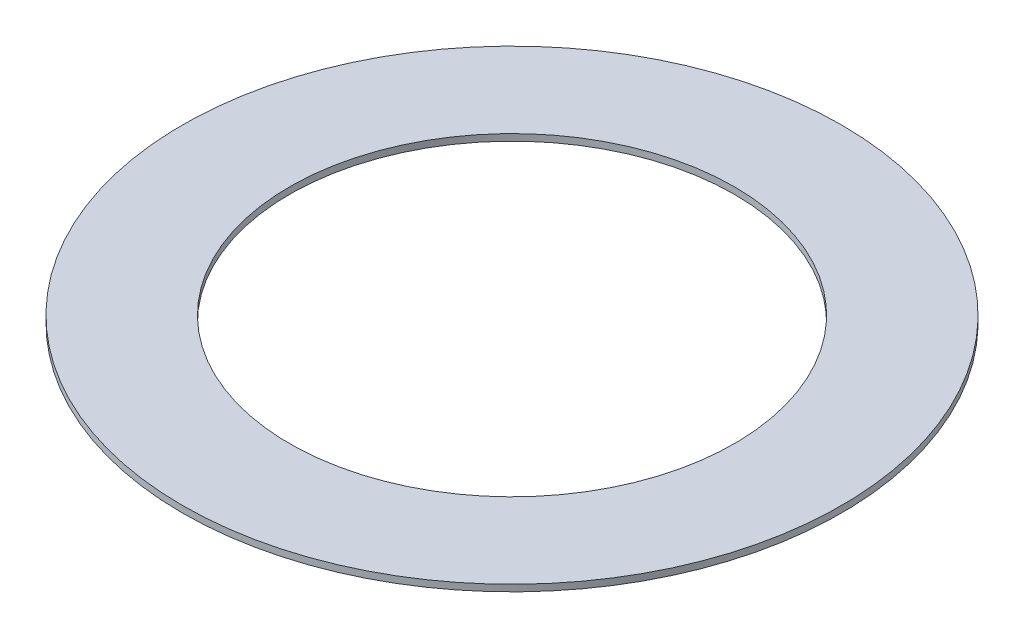
ISO-10303-21;
HEADER;
FILE_DESCRIPTION(('STEP AP214'),'2;1');
FILE_NAME('part.step','',(''),(''),'','','');
FILE_SCHEMA(('AUTOMOTIVE_DESIGN { 1 0 10303 214 1 1 1 1 }'));
ENDSEC;
DATA;
#1=APPLICATION_CONTEXT('core data for automotive mechanical design processes');
#2=APPLICATION_PROTOCOL_DEFINITION('international standard','automotive_design',2000,#1);
#3=PRODUCT_CONTEXT('',#1,'mechanical');
#4=PRODUCT('Part','Part','',(#3));
#5=PRODUCT_RELATED_PRODUCT_CATEGORY('part','',(#4));
#6=PRODUCT_DEFINITION_FORMATION('','',#4);
#7=PRODUCT_DEFINITION_CONTEXT('part definition',#1,'design');
#8=PRODUCT_DEFINITION('design','',#6,#7);
#9=PRODUCT_DEFINITION_SHAPE('','',#8);
#10=(LENGTH_UNIT() NAMED_UNIT(*) SI_UNIT(.MILLI.,.METRE.));
#11=(NAMED_UNIT(*) PLANE_ANGLE_UNIT() SI_UNIT($,.RADIAN.));
#12=(NAMED_UNIT(*) SI_UNIT($,.STERADIAN.) SOLID_ANGLE_UNIT());
#13=UNCERTAINTY_MEASURE_WITH_UNIT(LENGTH_MEASURE(1.E-05),#10,'distance_accuracy_value','');
#14=(GEOMETRIC_REPRESENTATION_CONTEXT(3) GLOBAL_UNCERTAINTY_ASSIGNED_CONTEXT((#13)) GLOBAL_UNIT_ASSIGNED_CONTEXT((#10,
#11,#12)) REPRESENTATION_CONTEXT('',''));
#15=CARTESIAN_POINT('',(0.,0.,0.));
#16=DIRECTION('',(0.,0.,1.));
#17=DIRECTION('',(1.,0.,0.));
#18=AXIS2_PLACEMENT_3D('',#15,#16,#17);
#19=CARTESIAN_POINT('',(0.,0.2,0.));
#20=DIRECTION('',(0.,-1.,0.));
#21=DIRECTION('',(0.,0.,-1.));
#22=AXIS2_PLACEMENT_3D('',#19,#20,#21);
#23=CYLINDRICAL_SURFACE('',#22,10.);
#24=CARTESIAN_POINT('',(0.,0.2,0.));
#25=DIRECTION('',(0.,-1.,0.));
#26=DIRECTION('',(0.,0.,-1.));
#27=AXIS2_PLACEMENT_3D('',#24,#25,#26);
#28=CIRCLE('',#27,10.);
#29=CARTESIAN_POINT('',(0.,0.2,-10.));
#30=VERTEX_POINT('',#29);
#31=EDGE_CURVE('E10',#30,#30,#28,.T.);
#32=ORIENTED_EDGE('',*,*,#31,.T.);
#33=EDGE_LOOP('',(#32));
#34=FACE_BOUND('',#33,.T.);
#35=CARTESIAN_POINT('',(0.,0.,0.));
#36=DIRECTION('',(0.,-1.,0.));
#37=DIRECTION('',(0.,0.,-1.));
#38=AXIS2_PLACEMENT_3D('',#35,#36,#37);
#39=CIRCLE('',#38,10.);
#40=CARTESIAN_POINT('',(0.,0.,-10.));
#41=VERTEX_POINT('',#40);
#42=EDGE_CURVE('E48',#41,#41,#39,.T.);
#43=ORIENTED_EDGE('',*,*,#42,.F.);
#44=EDGE_LOOP('',(#43));
#45=FACE_BOUND('',#44,.T.);
#46=ADVANCED_FACE('F34',(#34,#45),#23,.T.);
#47=CARTESIAN_POINT('',(10.,0.2,0.));
#48=DIRECTION('',(0.,1.,0.));
#49=DIRECTION('',(0.,0.,1.));
#50=AXIS2_PLACEMENT_3D('',#47,#48,#49);
#51=PLANE('',#50);
#52=CARTESIAN_POINT('',(0.,0.2,0.));
#53=DIRECTION('',(0.,-1.,0.));
#54=DIRECTION('',(0.,0.,-1.));
#55=AXIS2_PLACEMENT_3D('',#52,#53,#54);
#56=CIRCLE('',#55,6.75);
#57=CARTESIAN_POINT('',(0.,0.2,-6.75));
#58=VERTEX_POINT('',#57);
#59=EDGE_CURVE('E40',#58,#58,#56,.T.);
#60=ORIENTED_EDGE('',*,*,#59,.T.);
#61=EDGE_LOOP('',(#60));
#62=FACE_BOUND('',#61,.T.);
#63=ORIENTED_EDGE('',*,*,#31,.F.);
#64=EDGE_LOOP('',(#63));
#65=FACE_BOUND('',#64,.T.);
#66=ADVANCED_FACE('F58',(#62,#65),#51,.T.);
#67=CARTESIAN_POINT('',(0.,0.2,0.));
#68=DIRECTION('',(0.,-1.,0.));
#69=DIRECTION('',(0.,0.,-1.));
#70=AXIS2_PLACEMENT_3D('',#67,#68,#69);
#71=CYLINDRICAL_SURFACE('',#70,6.75);
#72=CARTESIAN_POINT('',(0.,0.,0.));
#73=DIRECTION('',(0.,-1.,0.));
#74=DIRECTION('',(0.,0.,-1.));
#75=AXIS2_PLACEMENT_3D('',#72,#73,#74);
#76=CIRCLE('',#75,6.75);
#77=CARTESIAN_POINT('',(0.,0.,-6.75));
#78=VERTEX_POINT('',#77);
#79=EDGE_CURVE('E44',#78,#78,#76,.T.);
#80=ORIENTED_EDGE('',*,*,#79,.T.);
#81=EDGE_LOOP('',(#80));
#82=FACE_BOUND('',#81,.T.);
#83=ORIENTED_EDGE('',*,*,#59,.F.);
#84=EDGE_LOOP('',(#83));
#85=FACE_BOUND('',#84,.T.);
#86=ADVANCED_FACE('F62',(#82,#85),#71,.F.);
#87=CARTESIAN_POINT('',(6.75,0.,0.));
#88=DIRECTION('',(0.,-1.,0.));
#89=DIRECTION('',(0.,0.,-1.));
#90=AXIS2_PLACEMENT_3D('',#87,#88,#89);
#91=PLANE('',#90);
#92=ORIENTED_EDGE('',*,*,#42,.T.);
#93=EDGE_LOOP('',(#92));
#94=FACE_BOUND('',#93,.T.);
#95=ORIENTED_EDGE('',*,*,#79,.F.);
#96=EDGE_LOOP('',(#95));
#97=FACE_BOUND('',#96,.T.);
#98=ADVANCED_FACE('F54',(#94,#97),#91,.T.);
#99=CLOSED_SHELL('',(#46,#66,#86,#98));
#100=MANIFOLD_SOLID_BREP('B2',#99);
#101=ADVANCED_BREP_SHAPE_REPRESENTATION('',(#18,#100),#14);
#102=SHAPE_DEFINITION_REPRESENTATION(#9,#101);
ENDSEC;
END-ISO-10303-21;
